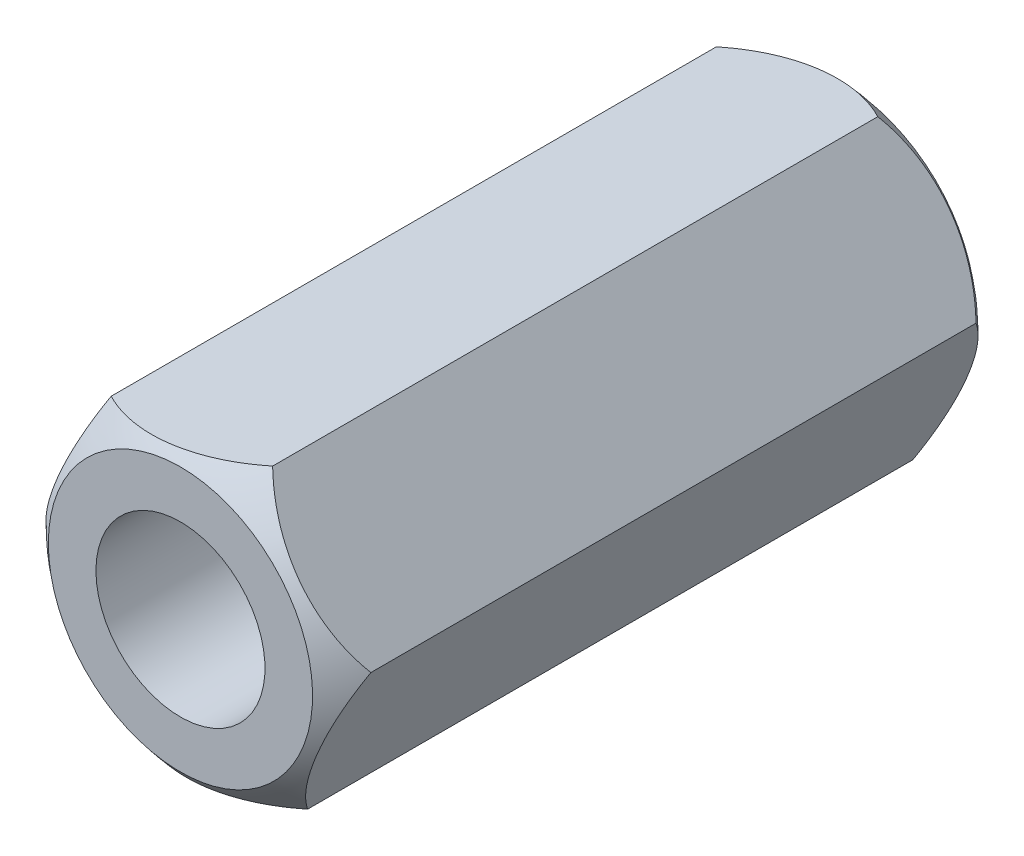
ISO-10303-21;
HEADER;
FILE_DESCRIPTION(('STEP AP214'),'2;1');
FILE_NAME('part.step','',(''),(''),'','','');
FILE_SCHEMA(('AUTOMOTIVE_DESIGN { 1 0 10303 214 1 1 1 1 }'));
ENDSEC;
DATA;
#1=APPLICATION_CONTEXT('core data for automotive mechanical design processes');
#2=APPLICATION_PROTOCOL_DEFINITION('international standard','automotive_design',2000,#1);
#3=PRODUCT_CONTEXT('',#1,'mechanical');
#4=PRODUCT('Part','Part','',(#3));
#5=PRODUCT_RELATED_PRODUCT_CATEGORY('part','',(#4));
#6=PRODUCT_DEFINITION_FORMATION('','',#4);
#7=PRODUCT_DEFINITION_CONTEXT('part definition',#1,'design');
#8=PRODUCT_DEFINITION('design','',#6,#7);
#9=PRODUCT_DEFINITION_SHAPE('','',#8);
#10=(LENGTH_UNIT() NAMED_UNIT(*) SI_UNIT(.MILLI.,.METRE.));
#11=(NAMED_UNIT(*) PLANE_ANGLE_UNIT() SI_UNIT($,.RADIAN.));
#12=(NAMED_UNIT(*) SI_UNIT($,.STERADIAN.) SOLID_ANGLE_UNIT());
#13=UNCERTAINTY_MEASURE_WITH_UNIT(LENGTH_MEASURE(1.E-05),#10,'distance_accuracy_value','');
#14=(GEOMETRIC_REPRESENTATION_CONTEXT(3) GLOBAL_UNCERTAINTY_ASSIGNED_CONTEXT((#13)) GLOBAL_UNIT_ASSIGNED_CONTEXT((#10,
#11,#12)) REPRESENTATION_CONTEXT('',''));
#15=CARTESIAN_POINT('',(0.,0.,0.));
#16=DIRECTION('',(0.,0.,1.));
#17=DIRECTION('',(1.,0.,0.));
#18=AXIS2_PLACEMENT_3D('',#15,#16,#17);
#19=CARTESIAN_POINT('',(9.73887211622447,1.21971440803114,40.));
#20=DIRECTION('',(-0.797176735977637,-0.603746015817943,0.));
#21=DIRECTION('',(0.603746015817943,-0.797176735977637,0.));
#22=AXIS2_PLACEMENT_3D('',#19,#20,#21);
#23=PLANE('',#22);
#24=DIRECTION('',(0.,0.,-1.));
#25=VECTOR('',#24,1.);
#26=CARTESIAN_POINT('',(3.81313239539536,9.04396786087388,40.));
#27=LINE('',#26,#25);
#28=CARTESIAN_POINT('',(3.81313239539536,9.04396786087388,38.2524071970561));
#29=VERTEX_POINT('',#28);
#30=CARTESIAN_POINT('',(3.81313239539536,9.04396786087388,1.74759280294386));
#31=VERTEX_POINT('',#30);
#32=EDGE_CURVE('E11',#29,#31,#27,.T.);
#33=ORIENTED_EDGE('',*,*,#32,.F.);
#34=CARTESIAN_POINT('',(6.77600225580991,5.13184113445251,29.7373608903021));
#35=DIRECTION('',(-0.797176735977637,-0.603746015817943,0.));
#36=DIRECTION('',(0.603746015817943,-0.797176735977637,0.));
#37=AXIS2_PLACEMENT_3D('',#34,#35,#36);
#38=CIRCLE('',#37,9.82798793952758);
#39=CARTESIAN_POINT('',(9.73887211622448,1.21971440803114,38.2524071970561));
#40=VERTEX_POINT('',#39);
#41=EDGE_CURVE('E92',#29,#40,#38,.F.);
#42=ORIENTED_EDGE('',*,*,#41,.T.);
#43=DIRECTION('',(0.,0.,-1.));
#44=VECTOR('',#43,1.);
#45=CARTESIAN_POINT('',(9.73887211622447,1.21971440803114,40.));
#46=LINE('',#45,#44);
#47=CARTESIAN_POINT('',(9.73887211622448,1.21971440803114,1.74759280294387));
#48=VERTEX_POINT('',#47);
#49=EDGE_CURVE('E62',#40,#48,#46,.T.);
#50=ORIENTED_EDGE('',*,*,#49,.T.);
#51=CARTESIAN_POINT('',(6.77600225580991,5.13184113445251,10.2626391096979));
#52=DIRECTION('',(-0.797176735977637,-0.603746015817943,0.));
#53=DIRECTION('',(0.603746015817943,-0.797176735977637,0.));
#54=AXIS2_PLACEMENT_3D('',#51,#52,#53);
#55=CIRCLE('',#54,9.82798793952758);
#56=EDGE_CURVE('E136',#48,#31,#55,.F.);
#57=ORIENTED_EDGE('',*,*,#56,.T.);
#58=EDGE_LOOP('',(#33,#42,#50,#57));
#59=FACE_BOUND('',#58,.T.);
#60=ADVANCED_FACE('F38',(#59),#23,.F.);
#61=CARTESIAN_POINT('',(3.81313239539536,9.04396786087388,40.));
#62=DIRECTION('',(0.124271019143161,-0.992248312571566,0.));
#63=DIRECTION('',(0.992248312571566,0.124271019143161,0.));
#64=AXIS2_PLACEMENT_3D('',#61,#62,#63);
#65=PLANE('',#64);
#66=DIRECTION('',(0.,0.,-1.));
#67=VECTOR('',#66,1.);
#68=CARTESIAN_POINT('',(-5.9257397208291,7.82425345284274,40.));
#69=LINE('',#68,#67);
#70=CARTESIAN_POINT('',(-5.9257397208291,7.82425345284274,38.2524071970561));
#71=VERTEX_POINT('',#70);
#72=CARTESIAN_POINT('',(-5.9257397208291,7.82425345284274,1.74759280294386));
#73=VERTEX_POINT('',#72);
#74=EDGE_CURVE('E46',#71,#73,#69,.T.);
#75=ORIENTED_EDGE('',*,*,#74,.F.);
#76=CARTESIAN_POINT('',(-1.05630366271687,8.43411065685831,29.7373608903021));
#77=DIRECTION('',(0.124271019143161,-0.992248312571566,0.));
#78=DIRECTION('',(0.992248312571566,0.124271019143161,0.));
#79=AXIS2_PLACEMENT_3D('',#76,#77,#78);
#80=CIRCLE('',#79,9.82798793952758);
#81=EDGE_CURVE('E99',#71,#29,#80,.F.);
#82=ORIENTED_EDGE('',*,*,#81,.T.);
#83=ORIENTED_EDGE('',*,*,#32,.T.);
#84=CARTESIAN_POINT('',(-1.05630366271687,8.43411065685831,10.2626391096979));
#85=DIRECTION('',(0.124271019143161,-0.992248312571566,0.));
#86=DIRECTION('',(0.992248312571566,0.124271019143161,0.));
#87=AXIS2_PLACEMENT_3D('',#84,#85,#86);
#88=CIRCLE('',#87,9.82798793952758);
#89=EDGE_CURVE('E133',#31,#73,#88,.F.);
#90=ORIENTED_EDGE('',*,*,#89,.T.);
#91=EDGE_LOOP('',(#75,#82,#83,#90));
#92=FACE_BOUND('',#91,.T.);
#93=ADVANCED_FACE('F159',(#92),#65,.F.);
#94=CARTESIAN_POINT('',(-5.9257397208291,7.82425345284274,40.));
#95=DIRECTION('',(0.921447755120799,-0.388502296753623,0.));
#96=DIRECTION('',(0.388502296753623,0.921447755120799,0.));
#97=AXIS2_PLACEMENT_3D('',#94,#95,#96);
#98=PLANE('',#97);
#99=DIRECTION('',(0.,0.,-1.));
#100=VECTOR('',#99,1.);
#101=CARTESIAN_POINT('',(-9.73887211622447,-1.21971440803115,40.));
#102=LINE('',#101,#100);
#103=CARTESIAN_POINT('',(-9.73887211622447,-1.21971440803115,38.2524071970561));
#104=VERTEX_POINT('',#103);
#105=CARTESIAN_POINT('',(-9.73887211622447,-1.21971440803115,1.74759280294386));
#106=VERTEX_POINT('',#105);
#107=EDGE_CURVE('E116',#104,#106,#102,.T.);
#108=ORIENTED_EDGE('',*,*,#107,.F.);
#109=CARTESIAN_POINT('',(-7.83230591852679,3.3022695224058,29.7373608903021));
#110=DIRECTION('',(0.921447755120799,-0.388502296753623,0.));
#111=DIRECTION('',(0.388502296753623,0.921447755120799,0.));
#112=AXIS2_PLACEMENT_3D('',#109,#110,#111);
#113=CIRCLE('',#112,9.82798793952758);
#114=EDGE_CURVE('E244',#104,#71,#113,.F.);
#115=ORIENTED_EDGE('',*,*,#114,.T.);
#116=ORIENTED_EDGE('',*,*,#74,.T.);
#117=CARTESIAN_POINT('',(-7.83230591852679,3.3022695224058,10.2626391096979));
#118=DIRECTION('',(0.921447755120799,-0.388502296753623,0.));
#119=DIRECTION('',(0.388502296753623,0.921447755120799,0.));
#120=AXIS2_PLACEMENT_3D('',#117,#118,#119);
#121=CIRCLE('',#120,9.82798793952758);
#122=EDGE_CURVE('E130',#73,#106,#121,.F.);
#123=ORIENTED_EDGE('',*,*,#122,.T.);
#124=EDGE_LOOP('',(#108,#115,#116,#123));
#125=FACE_BOUND('',#124,.T.);
#126=ADVANCED_FACE('F163',(#125),#98,.F.);
#127=CARTESIAN_POINT('',(-9.73887211622447,-1.21971440803115,40.));
#128=DIRECTION('',(0.797176735977638,0.603746015817943,0.));
#129=DIRECTION('',(-0.603746015817943,0.797176735977638,0.));
#130=AXIS2_PLACEMENT_3D('',#127,#128,#129);
#131=PLANE('',#130);
#132=DIRECTION('',(0.,0.,-1.));
#133=VECTOR('',#132,1.);
#134=CARTESIAN_POINT('',(-3.81313239539537,-9.04396786087388,40.));
#135=LINE('',#134,#133);
#136=CARTESIAN_POINT('',(-3.81313239539537,-9.04396786087388,38.2524071970561));
#137=VERTEX_POINT('',#136);
#138=CARTESIAN_POINT('',(-3.81313239539537,-9.04396786087388,1.74759280294386));
#139=VERTEX_POINT('',#138);
#140=EDGE_CURVE('E108',#137,#139,#135,.T.);
#141=ORIENTED_EDGE('',*,*,#140,.F.);
#142=CARTESIAN_POINT('',(-6.77600225580992,-5.13184113445251,29.7373608903021));
#143=DIRECTION('',(0.797176735977638,0.603746015817943,0.));
#144=DIRECTION('',(-0.603746015817943,0.797176735977638,0.));
#145=AXIS2_PLACEMENT_3D('',#142,#143,#144);
#146=CIRCLE('',#145,9.82798793952758);
#147=EDGE_CURVE('E240',#137,#104,#146,.F.);
#148=ORIENTED_EDGE('',*,*,#147,.T.);
#149=ORIENTED_EDGE('',*,*,#107,.T.);
#150=CARTESIAN_POINT('',(-6.77600225580992,-5.13184113445251,10.2626391096979));
#151=DIRECTION('',(0.797176735977638,0.603746015817943,0.));
#152=DIRECTION('',(-0.603746015817943,0.797176735977638,0.));
#153=AXIS2_PLACEMENT_3D('',#150,#151,#152);
#154=CIRCLE('',#153,9.82798793952758);
#155=EDGE_CURVE('E124',#106,#139,#154,.F.);
#156=ORIENTED_EDGE('',*,*,#155,.T.);
#157=EDGE_LOOP('',(#141,#148,#149,#156));
#158=FACE_BOUND('',#157,.T.);
#159=ADVANCED_FACE('F168',(#158),#131,.F.);
#160=CARTESIAN_POINT('',(-3.81313239539537,-9.04396786087388,40.));
#161=DIRECTION('',(-0.124271019143162,0.992248312571566,0.));
#162=DIRECTION('',(-0.992248312571566,-0.124271019143162,0.));
#163=AXIS2_PLACEMENT_3D('',#160,#161,#162);
#164=PLANE('',#163);
#165=DIRECTION('',(0.,0.,-1.));
#166=VECTOR('',#165,1.);
#167=CARTESIAN_POINT('',(5.92573972082911,-7.82425345284273,40.));
#168=LINE('',#167,#166);
#169=CARTESIAN_POINT('',(5.92573972082911,-7.82425345284273,38.2524071970561));
#170=VERTEX_POINT('',#169);
#171=CARTESIAN_POINT('',(5.92573972082911,-7.82425345284273,1.74759280294386));
#172=VERTEX_POINT('',#171);
#173=EDGE_CURVE('E105',#170,#172,#168,.T.);
#174=ORIENTED_EDGE('',*,*,#173,.F.);
#175=CARTESIAN_POINT('',(1.05630366271687,-8.43411065685831,29.7373608903021));
#176=DIRECTION('',(-0.124271019143162,0.992248312571566,0.));
#177=DIRECTION('',(-0.992248312571566,-0.124271019143162,0.));
#178=AXIS2_PLACEMENT_3D('',#175,#176,#177);
#179=CIRCLE('',#178,9.82798793952758);
#180=EDGE_CURVE('E54',#170,#137,#179,.F.);
#181=ORIENTED_EDGE('',*,*,#180,.T.);
#182=ORIENTED_EDGE('',*,*,#140,.T.);
#183=CARTESIAN_POINT('',(1.05630366271687,-8.43411065685831,10.2626391096979));
#184=DIRECTION('',(-0.124271019143162,0.992248312571566,0.));
#185=DIRECTION('',(-0.992248312571566,-0.124271019143162,0.));
#186=AXIS2_PLACEMENT_3D('',#183,#184,#185);
#187=CIRCLE('',#186,9.82798793952758);
#188=EDGE_CURVE('E121',#139,#172,#187,.F.);
#189=ORIENTED_EDGE('',*,*,#188,.T.);
#190=EDGE_LOOP('',(#174,#181,#182,#189));
#191=FACE_BOUND('',#190,.T.);
#192=ADVANCED_FACE('F175',(#191),#164,.F.);
#193=CARTESIAN_POINT('',(5.92573972082911,-7.82425345284273,40.));
#194=DIRECTION('',(-0.921447755120799,0.388502296753624,0.));
#195=DIRECTION('',(-0.388502296753624,-0.921447755120799,0.));
#196=AXIS2_PLACEMENT_3D('',#193,#194,#195);
#197=PLANE('',#196);
#198=ORIENTED_EDGE('',*,*,#49,.F.);
#199=CARTESIAN_POINT('',(7.83230591852679,-3.3022695224058,29.7373608903021));
#200=DIRECTION('',(-0.921447755120799,0.388502296753624,0.));
#201=DIRECTION('',(-0.388502296753624,-0.921447755120799,0.));
#202=AXIS2_PLACEMENT_3D('',#199,#200,#201);
#203=CIRCLE('',#202,9.82798793952758);
#204=EDGE_CURVE('E90',#40,#170,#203,.F.);
#205=ORIENTED_EDGE('',*,*,#204,.T.);
#206=ORIENTED_EDGE('',*,*,#173,.T.);
#207=CARTESIAN_POINT('',(7.83230591852679,-3.3022695224058,10.2626391096979));
#208=DIRECTION('',(-0.921447755120799,0.388502296753624,0.));
#209=DIRECTION('',(-0.388502296753624,-0.921447755120799,0.));
#210=AXIS2_PLACEMENT_3D('',#207,#208,#209);
#211=CIRCLE('',#210,9.82798793952757);
#212=EDGE_CURVE('E104',#172,#48,#211,.F.);
#213=ORIENTED_EDGE('',*,*,#212,.T.);
#214=EDGE_LOOP('',(#198,#205,#206,#213));
#215=FACE_BOUND('',#214,.T.);
#216=ADVANCED_FACE('F102',(#215),#197,.F.);
#217=CARTESIAN_POINT('',(9.73887211622447,1.21971440803114,40.));
#218=DIRECTION('',(0.,0.,-1.));
#219=DIRECTION('',(-1.,0.,0.));
#220=AXIS2_PLACEMENT_3D('',#217,#218,#219);
#221=PLANE('',#220);
#222=CARTESIAN_POINT('',(0.,0.,40.));
#223=DIRECTION('',(0.,0.,-1.));
#224=DIRECTION('',(-1.,0.,0.));
#225=AXIS2_PLACEMENT_3D('',#222,#223,#224);
#226=CIRCLE('',#225,7.96979205773889);
#227=CARTESIAN_POINT('',(-7.96979205773889,0.,40.));
#228=VERTEX_POINT('',#227);
#229=EDGE_CURVE('E41',#228,#228,#226,.F.);
#230=ORIENTED_EDGE('',*,*,#229,.T.);
#231=EDGE_LOOP('',(#230));
#232=FACE_BOUND('',#231,.T.);
#233=CARTESIAN_POINT('',(0.,0.,40.));
#234=DIRECTION('',(0.,0.,-1.));
#235=DIRECTION('',(-1.,0.,0.));
#236=AXIS2_PLACEMENT_3D('',#233,#234,#235);
#237=CIRCLE('',#236,5.09999999999999);
#238=CARTESIAN_POINT('',(-5.09999999999999,0.,40.));
#239=VERTEX_POINT('',#238);
#240=EDGE_CURVE('E111',#239,#239,#237,.T.);
#241=ORIENTED_EDGE('',*,*,#240,.T.);
#242=EDGE_LOOP('',(#241));
#243=FACE_BOUND('',#242,.T.);
#244=ADVANCED_FACE('F140',(#232,#243),#221,.F.);
#245=CARTESIAN_POINT('',(9.73887211622447,1.21971440803114,0.));
#246=DIRECTION('',(0.,0.,-1.));
#247=DIRECTION('',(-1.,0.,0.));
#248=AXIS2_PLACEMENT_3D('',#245,#246,#247);
#249=PLANE('',#248);
#250=CARTESIAN_POINT('',(0.,0.,0.));
#251=DIRECTION('',(0.,0.,-1.));
#252=DIRECTION('',(-1.,0.,0.));
#253=AXIS2_PLACEMENT_3D('',#250,#251,#252);
#254=CIRCLE('',#253,7.96979205773889);
#255=CARTESIAN_POINT('',(-7.96979205773889,0.,0.));
#256=VERTEX_POINT('',#255);
#257=EDGE_CURVE('E98',#256,#256,#254,.F.);
#258=ORIENTED_EDGE('',*,*,#257,.F.);
#259=EDGE_LOOP('',(#258));
#260=FACE_BOUND('',#259,.T.);
#261=CARTESIAN_POINT('',(0.,0.,0.));
#262=DIRECTION('',(0.,0.,-1.));
#263=DIRECTION('',(-1.,0.,0.));
#264=AXIS2_PLACEMENT_3D('',#261,#262,#263);
#265=CIRCLE('',#264,5.1);
#266=CARTESIAN_POINT('',(-5.1,0.,0.));
#267=VERTEX_POINT('',#266);
#268=EDGE_CURVE('E106',#267,#267,#265,.T.);
#269=ORIENTED_EDGE('',*,*,#268,.F.);
#270=EDGE_LOOP('',(#269));
#271=FACE_BOUND('',#270,.T.);
#272=ADVANCED_FACE('F146',(#260,#271),#249,.T.);
#273=CARTESIAN_POINT('',(0.,0.,0.));
#274=DIRECTION('',(0.,0.,-1.));
#275=DIRECTION('',(-1.,0.,0.));
#276=AXIS2_PLACEMENT_3D('',#273,#274,#275);
#277=CYLINDRICAL_SURFACE('',#276,5.09999999999999);
#278=ORIENTED_EDGE('',*,*,#240,.F.);
#279=EDGE_LOOP('',(#278));
#280=FACE_BOUND('',#279,.T.);
#281=ORIENTED_EDGE('',*,*,#268,.T.);
#282=EDGE_LOOP('',(#281));
#283=FACE_BOUND('',#282,.T.);
#284=ADVANCED_FACE('F142',(#280,#283),#277,.F.);
#285=CARTESIAN_POINT('',(0.,0.,10.2626391096979));
#286=DIRECTION('',(0.,0.,1.));
#287=DIRECTION('',(1.,0.,0.));
#288=AXIS2_PLACEMENT_3D('',#285,#286,#287);
#289=SPHERICAL_SURFACE('',#288,12.9938195669903);
#290=ORIENTED_EDGE('',*,*,#257,.T.);
#291=EDGE_LOOP('',(#290));
#292=FACE_BOUND('',#291,.T.);
#293=ORIENTED_EDGE('',*,*,#212,.F.);
#294=ORIENTED_EDGE('',*,*,#188,.F.);
#295=ORIENTED_EDGE('',*,*,#155,.F.);
#296=ORIENTED_EDGE('',*,*,#122,.F.);
#297=ORIENTED_EDGE('',*,*,#89,.F.);
#298=ORIENTED_EDGE('',*,*,#56,.F.);
#299=EDGE_LOOP('',(#293,#294,#295,#296,#297,#298));
#300=FACE_BOUND('',#299,.T.);
#301=ADVANCED_FACE('F145',(#292,#300),#289,.T.);
#302=CARTESIAN_POINT('',(0.,0.,29.7373608903021));
#303=DIRECTION('',(0.,0.,1.));
#304=DIRECTION('',(1.,0.,0.));
#305=AXIS2_PLACEMENT_3D('',#302,#303,#304);
#306=SPHERICAL_SURFACE('',#305,12.9938195669903);
#307=ORIENTED_EDGE('',*,*,#229,.F.);
#308=EDGE_LOOP('',(#307));
#309=FACE_BOUND('',#308,.T.);
#310=ORIENTED_EDGE('',*,*,#81,.F.);
#311=ORIENTED_EDGE('',*,*,#114,.F.);
#312=ORIENTED_EDGE('',*,*,#147,.F.);
#313=ORIENTED_EDGE('',*,*,#180,.F.);
#314=ORIENTED_EDGE('',*,*,#204,.F.);
#315=ORIENTED_EDGE('',*,*,#41,.F.);
#316=EDGE_LOOP('',(#310,#311,#312,#313,#314,#315));
#317=FACE_BOUND('',#316,.T.);
#318=ADVANCED_FACE('F91',(#309,#317),#306,.T.);
#319=CLOSED_SHELL('',(#60,#93,#126,#159,#192,#216,#244,#272,#284,#301,#318));
#320=MANIFOLD_SOLID_BREP('B2',#319);
#321=ADVANCED_BREP_SHAPE_REPRESENTATION('',(#18,#320),#14);
#322=SHAPE_DEFINITION_REPRESENTATION(#9,#321);
ENDSEC;
END-ISO-10303-21;
